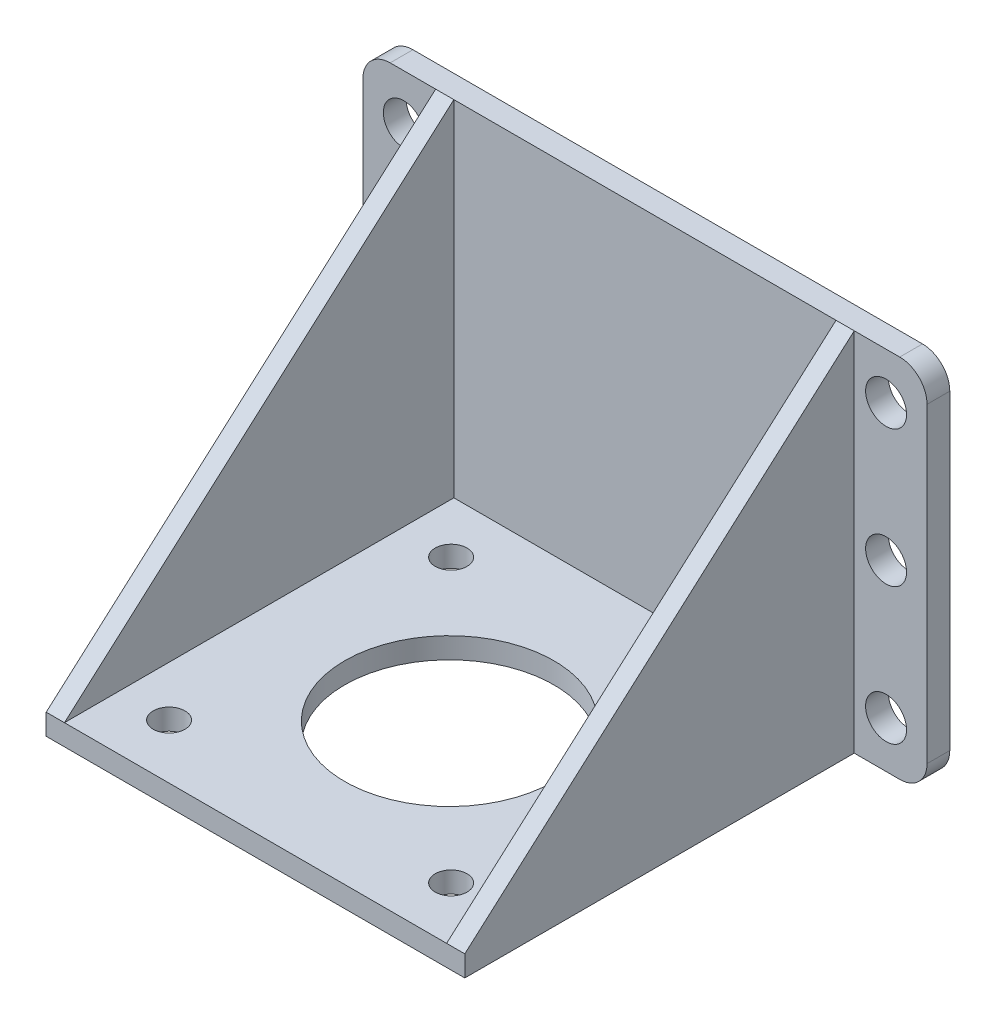
ISO-10303-21;
HEADER;
FILE_DESCRIPTION(('STEP AP214'),'2;1');
FILE_NAME('part.step','',(''),(''),'','','');
FILE_SCHEMA(('AUTOMOTIVE_DESIGN { 1 0 10303 214 1 1 1 1 }'));
ENDSEC;
DATA;
#1=APPLICATION_CONTEXT('core data for automotive mechanical design processes');
#2=APPLICATION_PROTOCOL_DEFINITION('international standard','automotive_design',2000,#1);
#3=PRODUCT_CONTEXT('',#1,'mechanical');
#4=PRODUCT('Part','Part','',(#3));
#5=PRODUCT_RELATED_PRODUCT_CATEGORY('part','',(#4));
#6=PRODUCT_DEFINITION_FORMATION('','',#4);
#7=PRODUCT_DEFINITION_CONTEXT('part definition',#1,'design');
#8=PRODUCT_DEFINITION('design','',#6,#7);
#9=PRODUCT_DEFINITION_SHAPE('','',#8);
#10=(LENGTH_UNIT() NAMED_UNIT(*) SI_UNIT(.MILLI.,.METRE.));
#11=(NAMED_UNIT(*) PLANE_ANGLE_UNIT() SI_UNIT($,.RADIAN.));
#12=(NAMED_UNIT(*) SI_UNIT($,.STERADIAN.) SOLID_ANGLE_UNIT());
#13=UNCERTAINTY_MEASURE_WITH_UNIT(LENGTH_MEASURE(1.E-05),#10,'distance_accuracy_value','');
#14=(GEOMETRIC_REPRESENTATION_CONTEXT(3) GLOBAL_UNCERTAINTY_ASSIGNED_CONTEXT((#13)) GLOBAL_UNIT_ASSIGNED_CONTEXT((#10,
#11,#12)) REPRESENTATION_CONTEXT('',''));
#15=CARTESIAN_POINT('',(0.,0.,0.));
#16=DIRECTION('',(0.,0.,1.));
#17=DIRECTION('',(1.,0.,0.));
#18=AXIS2_PLACEMENT_3D('',#15,#16,#17);
#19=CARTESIAN_POINT('',(31.,20.1,0.));
#20=DIRECTION('',(0.,0.,1.));
#21=DIRECTION('',(1.,0.,0.));
#22=AXIS2_PLACEMENT_3D('',#19,#20,#21);
#23=PLANE('',#22);
#24=CARTESIAN_POINT('',(57.5,5.1,0.));
#25=DIRECTION('',(0.,0.,-1.));
#26=DIRECTION('',(1.,0.,0.));
#27=AXIS2_PLACEMENT_3D('',#24,#25,#26);
#28=CIRCLE('',#27,2.25);
#29=CARTESIAN_POINT('',(55.25,5.1,0.));
#30=VERTEX_POINT('',#29);
#31=EDGE_CURVE('E488',#30,#30,#28,.T.);
#32=ORIENTED_EDGE('',*,*,#31,.F.);
#33=EDGE_LOOP('',(#32));
#34=FACE_BOUND('',#33,.T.);
#35=CARTESIAN_POINT('',(4.5,5.1,0.));
#36=DIRECTION('',(0.,0.,-1.));
#37=DIRECTION('',(1.,0.,0.));
#38=AXIS2_PLACEMENT_3D('',#35,#36,#37);
#39=CIRCLE('',#38,2.25);
#40=CARTESIAN_POINT('',(2.25,5.1,0.));
#41=VERTEX_POINT('',#40);
#42=EDGE_CURVE('E347',#41,#41,#39,.T.);
#43=ORIENTED_EDGE('',*,*,#42,.F.);
#44=EDGE_LOOP('',(#43));
#45=FACE_BOUND('',#44,.T.);
#46=CARTESIAN_POINT('',(4.5,35.1,0.));
#47=DIRECTION('',(0.,0.,-1.));
#48=DIRECTION('',(1.,0.,0.));
#49=AXIS2_PLACEMENT_3D('',#46,#47,#48);
#50=CIRCLE('',#49,2.25);
#51=CARTESIAN_POINT('',(2.25,35.1,0.));
#52=VERTEX_POINT('',#51);
#53=EDGE_CURVE('E346',#52,#52,#50,.T.);
#54=ORIENTED_EDGE('',*,*,#53,.F.);
#55=EDGE_LOOP('',(#54));
#56=FACE_BOUND('',#55,.T.);
#57=CARTESIAN_POINT('',(57.5,35.1,0.));
#58=DIRECTION('',(0.,0.,-1.));
#59=DIRECTION('',(1.,0.,0.));
#60=AXIS2_PLACEMENT_3D('',#57,#58,#59);
#61=CIRCLE('',#60,2.25);
#62=CARTESIAN_POINT('',(55.25,35.1,0.));
#63=VERTEX_POINT('',#62);
#64=EDGE_CURVE('E318',#63,#63,#61,.T.);
#65=ORIENTED_EDGE('',*,*,#64,.F.);
#66=EDGE_LOOP('',(#65));
#67=FACE_BOUND('',#66,.T.);
#68=CARTESIAN_POINT('',(4.5,20.1,0.));
#69=DIRECTION('',(0.,0.,-1.));
#70=DIRECTION('',(1.,0.,0.));
#71=AXIS2_PLACEMENT_3D('',#68,#69,#70);
#72=CIRCLE('',#71,2.25);
#73=CARTESIAN_POINT('',(2.25,20.1,0.));
#74=VERTEX_POINT('',#73);
#75=EDGE_CURVE('E335',#74,#74,#72,.T.);
#76=ORIENTED_EDGE('',*,*,#75,.F.);
#77=EDGE_LOOP('',(#76));
#78=FACE_BOUND('',#77,.T.);
#79=CARTESIAN_POINT('',(57.5,20.1,0.));
#80=DIRECTION('',(0.,0.,-1.));
#81=DIRECTION('',(1.,0.,0.));
#82=AXIS2_PLACEMENT_3D('',#79,#80,#81);
#83=CIRCLE('',#82,2.25);
#84=CARTESIAN_POINT('',(55.25,20.1,0.));
#85=VERTEX_POINT('',#84);
#86=EDGE_CURVE('E287',#85,#85,#83,.T.);
#87=ORIENTED_EDGE('',*,*,#86,.F.);
#88=EDGE_LOOP('',(#87));
#89=FACE_BOUND('',#88,.T.);
#90=CARTESIAN_POINT('',(3.,3.,0.));
#91=DIRECTION('',(0.,0.,1.));
#92=DIRECTION('',(-1.,0.,0.));
#93=AXIS2_PLACEMENT_3D('',#90,#91,#92);
#94=CIRCLE('',#93,3.);
#95=CARTESIAN_POINT('',(0.,3.,0.));
#96=VERTEX_POINT('',#95);
#97=CARTESIAN_POINT('',(3.,0.,0.));
#98=VERTEX_POINT('',#97);
#99=EDGE_CURVE('E11',#96,#98,#94,.T.);
#100=ORIENTED_EDGE('',*,*,#99,.F.);
#101=DIRECTION('',(0.,-1.,0.));
#102=VECTOR('',#101,1.);
#103=CARTESIAN_POINT('',(0.,37.2,0.));
#104=LINE('',#103,#102);
#105=CARTESIAN_POINT('',(0.,37.2,0.));
#106=VERTEX_POINT('',#105);
#107=EDGE_CURVE('E284',#106,#96,#104,.T.);
#108=ORIENTED_EDGE('',*,*,#107,.F.);
#109=CARTESIAN_POINT('',(3.,37.2,0.));
#110=DIRECTION('',(0.,0.,1.));
#111=DIRECTION('',(0.,1.,0.));
#112=AXIS2_PLACEMENT_3D('',#109,#110,#111);
#113=CIRCLE('',#112,3.);
#114=CARTESIAN_POINT('',(3.,40.2,0.));
#115=VERTEX_POINT('',#114);
#116=EDGE_CURVE('E231',#115,#106,#113,.T.);
#117=ORIENTED_EDGE('',*,*,#116,.F.);
#118=DIRECTION('',(-1.,0.,0.));
#119=VECTOR('',#118,1.);
#120=CARTESIAN_POINT('',(59.,40.2,0.));
#121=LINE('',#120,#119);
#122=CARTESIAN_POINT('',(59.,40.2,0.));
#123=VERTEX_POINT('',#122);
#124=EDGE_CURVE('E396',#123,#115,#121,.T.);
#125=ORIENTED_EDGE('',*,*,#124,.F.);
#126=CARTESIAN_POINT('',(59.,37.2,0.));
#127=DIRECTION('',(0.,0.,1.));
#128=DIRECTION('',(1.,0.,0.));
#129=AXIS2_PLACEMENT_3D('',#126,#127,#128);
#130=CIRCLE('',#129,3.);
#131=CARTESIAN_POINT('',(62.,37.2,0.));
#132=VERTEX_POINT('',#131);
#133=EDGE_CURVE('E425',#132,#123,#130,.T.);
#134=ORIENTED_EDGE('',*,*,#133,.F.);
#135=DIRECTION('',(0.,1.,0.));
#136=VECTOR('',#135,1.);
#137=CARTESIAN_POINT('',(62.,3.,0.));
#138=LINE('',#137,#136);
#139=CARTESIAN_POINT('',(62.,3.,0.));
#140=VERTEX_POINT('',#139);
#141=EDGE_CURVE('E361',#140,#132,#138,.T.);
#142=ORIENTED_EDGE('',*,*,#141,.F.);
#143=CARTESIAN_POINT('',(59.,3.,0.));
#144=DIRECTION('',(0.,0.,1.));
#145=DIRECTION('',(0.,-1.,0.));
#146=AXIS2_PLACEMENT_3D('',#143,#144,#145);
#147=CIRCLE('',#146,3.);
#148=CARTESIAN_POINT('',(59.,0.,0.));
#149=VERTEX_POINT('',#148);
#150=EDGE_CURVE('E360',#149,#140,#147,.T.);
#151=ORIENTED_EDGE('',*,*,#150,.F.);
#152=DIRECTION('',(1.,0.,0.));
#153=VECTOR('',#152,1.);
#154=CARTESIAN_POINT('',(3.,0.,0.));
#155=LINE('',#154,#153);
#156=EDGE_CURVE('E28',#98,#149,#155,.T.);
#157=ORIENTED_EDGE('',*,*,#156,.F.);
#158=EDGE_LOOP('',(#100,#108,#117,#125,#134,#142,#151,#157));
#159=FACE_BOUND('',#158,.T.);
#160=ADVANCED_FACE('F17',(#34,#45,#56,#67,#78,#89,#159),#23,.F.);
#161=CARTESIAN_POINT('',(3.,3.,0.));
#162=DIRECTION('',(0.,0.,1.));
#163=DIRECTION('',(-1.,0.,0.));
#164=AXIS2_PLACEMENT_3D('',#161,#162,#163);
#165=CYLINDRICAL_SURFACE('',#164,3.);
#166=ORIENTED_EDGE('',*,*,#99,.T.);
#167=DIRECTION('',(0.,0.,1.));
#168=VECTOR('',#167,1.);
#169=CARTESIAN_POINT('',(3.,0.,0.));
#170=LINE('',#169,#168);
#171=CARTESIAN_POINT('',(3.,0.,2.5));
#172=VERTEX_POINT('',#171);
#173=EDGE_CURVE('E402',#98,#172,#170,.T.);
#174=ORIENTED_EDGE('',*,*,#173,.T.);
#175=CARTESIAN_POINT('',(3.,3.,2.5));
#176=DIRECTION('',(0.,0.,1.));
#177=DIRECTION('',(-1.,0.,0.));
#178=AXIS2_PLACEMENT_3D('',#175,#176,#177);
#179=CIRCLE('',#178,3.);
#180=CARTESIAN_POINT('',(0.,3.,2.5));
#181=VERTEX_POINT('',#180);
#182=EDGE_CURVE('E245',#181,#172,#179,.T.);
#183=ORIENTED_EDGE('',*,*,#182,.F.);
#184=DIRECTION('',(0.,0.,1.));
#185=VECTOR('',#184,1.);
#186=CARTESIAN_POINT('',(0.,3.,0.));
#187=LINE('',#186,#185);
#188=EDGE_CURVE('E236',#96,#181,#187,.T.);
#189=ORIENTED_EDGE('',*,*,#188,.F.);
#190=EDGE_LOOP('',(#166,#174,#183,#189));
#191=FACE_BOUND('',#190,.T.);
#192=ADVANCED_FACE('F609',(#191),#165,.T.);
#193=CARTESIAN_POINT('',(3.,0.,0.));
#194=DIRECTION('',(0.,-1.,0.));
#195=DIRECTION('',(0.,0.,-1.));
#196=AXIS2_PLACEMENT_3D('',#193,#194,#195);
#197=PLANE('',#196);
#198=CARTESIAN_POINT('',(31.,0.,24.));
#199=DIRECTION('',(0.,1.,0.));
#200=DIRECTION('',(1.,0.,0.));
#201=AXIS2_PLACEMENT_3D('',#198,#199,#200);
#202=CIRCLE('',#201,11.5);
#203=CARTESIAN_POINT('',(19.5,0.,24.));
#204=VERTEX_POINT('',#203);
#205=EDGE_CURVE('E273',#204,#204,#202,.T.);
#206=ORIENTED_EDGE('',*,*,#205,.T.);
#207=EDGE_LOOP('',(#206));
#208=FACE_BOUND('',#207,.T.);
#209=CARTESIAN_POINT('',(15.5,0.,39.3));
#210=DIRECTION('',(0.,1.,0.));
#211=DIRECTION('',(1.,0.,0.));
#212=AXIS2_PLACEMENT_3D('',#209,#210,#211);
#213=CIRCLE('',#212,1.75);
#214=CARTESIAN_POINT('',(13.75,0.,39.3));
#215=VERTEX_POINT('',#214);
#216=EDGE_CURVE('E403',#215,#215,#213,.T.);
#217=ORIENTED_EDGE('',*,*,#216,.T.);
#218=EDGE_LOOP('',(#217));
#219=FACE_BOUND('',#218,.T.);
#220=CARTESIAN_POINT('',(46.5,0.,8.3));
#221=DIRECTION('',(0.,1.,0.));
#222=DIRECTION('',(1.,0.,0.));
#223=AXIS2_PLACEMENT_3D('',#220,#221,#222);
#224=CIRCLE('',#223,1.75);
#225=CARTESIAN_POINT('',(44.75,0.,8.3));
#226=VERTEX_POINT('',#225);
#227=EDGE_CURVE('E411',#226,#226,#224,.T.);
#228=ORIENTED_EDGE('',*,*,#227,.T.);
#229=EDGE_LOOP('',(#228));
#230=FACE_BOUND('',#229,.T.);
#231=CARTESIAN_POINT('',(46.5,0.,39.3));
#232=DIRECTION('',(0.,1.,0.));
#233=DIRECTION('',(1.,0.,0.));
#234=AXIS2_PLACEMENT_3D('',#231,#232,#233);
#235=CIRCLE('',#234,1.75);
#236=CARTESIAN_POINT('',(44.75,0.,39.3));
#237=VERTEX_POINT('',#236);
#238=EDGE_CURVE('E300',#237,#237,#235,.T.);
#239=ORIENTED_EDGE('',*,*,#238,.T.);
#240=EDGE_LOOP('',(#239));
#241=FACE_BOUND('',#240,.T.);
#242=CARTESIAN_POINT('',(15.5,0.,8.3));
#243=DIRECTION('',(0.,1.,0.));
#244=DIRECTION('',(1.,0.,0.));
#245=AXIS2_PLACEMENT_3D('',#242,#243,#244);
#246=CIRCLE('',#245,1.75);
#247=CARTESIAN_POINT('',(13.75,0.,8.3));
#248=VERTEX_POINT('',#247);
#249=EDGE_CURVE('E293',#248,#248,#246,.T.);
#250=ORIENTED_EDGE('',*,*,#249,.T.);
#251=EDGE_LOOP('',(#250));
#252=FACE_BOUND('',#251,.T.);
#253=DIRECTION('',(1.,0.,0.));
#254=VECTOR('',#253,1.);
#255=CARTESIAN_POINT('',(3.,0.,45.3));
#256=LINE('',#255,#254);
#257=CARTESIAN_POINT('',(8.,0.,45.3));
#258=VERTEX_POINT('',#257);
#259=CARTESIAN_POINT('',(54.,0.,45.3));
#260=VERTEX_POINT('',#259);
#261=EDGE_CURVE('E383',#258,#260,#256,.T.);
#262=ORIENTED_EDGE('',*,*,#261,.F.);
#263=DIRECTION('',(0.,0.,1.));
#264=VECTOR('',#263,1.);
#265=CARTESIAN_POINT('',(8.,0.,2.5));
#266=LINE('',#265,#264);
#267=CARTESIAN_POINT('',(8.,0.,2.5));
#268=VERTEX_POINT('',#267);
#269=EDGE_CURVE('E277',#268,#258,#266,.T.);
#270=ORIENTED_EDGE('',*,*,#269,.F.);
#271=DIRECTION('',(1.,0.,0.));
#272=VECTOR('',#271,1.);
#273=CARTESIAN_POINT('',(3.,0.,2.5));
#274=LINE('',#273,#272);
#275=EDGE_CURVE('E325',#172,#268,#274,.T.);
#276=ORIENTED_EDGE('',*,*,#275,.F.);
#277=ORIENTED_EDGE('',*,*,#173,.F.);
#278=ORIENTED_EDGE('',*,*,#156,.T.);
#279=DIRECTION('',(0.,0.,1.));
#280=VECTOR('',#279,1.);
#281=CARTESIAN_POINT('',(59.,0.,0.));
#282=LINE('',#281,#280);
#283=CARTESIAN_POINT('',(59.,0.,2.5));
#284=VERTEX_POINT('',#283);
#285=EDGE_CURVE('E453',#149,#284,#282,.T.);
#286=ORIENTED_EDGE('',*,*,#285,.T.);
#287=DIRECTION('',(1.,0.,0.));
#288=VECTOR('',#287,1.);
#289=CARTESIAN_POINT('',(3.,0.,2.5));
#290=LINE('',#289,#288);
#291=CARTESIAN_POINT('',(54.,0.,2.5));
#292=VERTEX_POINT('',#291);
#293=EDGE_CURVE('E378',#292,#284,#290,.T.);
#294=ORIENTED_EDGE('',*,*,#293,.F.);
#295=DIRECTION('',(0.,0.,1.));
#296=VECTOR('',#295,1.);
#297=CARTESIAN_POINT('',(54.,0.,2.5));
#298=LINE('',#297,#296);
#299=EDGE_CURVE('E283',#292,#260,#298,.T.);
#300=ORIENTED_EDGE('',*,*,#299,.T.);
#301=EDGE_LOOP('',(#262,#270,#276,#277,#278,#286,#294,#300));
#302=FACE_BOUND('',#301,.T.);
#303=ADVANCED_FACE('F607',(#208,#219,#230,#241,#252,#302),#197,.T.);
#304=CARTESIAN_POINT('',(59.,3.,0.));
#305=DIRECTION('',(0.,0.,1.));
#306=DIRECTION('',(0.,-1.,0.));
#307=AXIS2_PLACEMENT_3D('',#304,#305,#306);
#308=CYLINDRICAL_SURFACE('',#307,3.);
#309=ORIENTED_EDGE('',*,*,#150,.T.);
#310=DIRECTION('',(0.,0.,1.));
#311=VECTOR('',#310,1.);
#312=CARTESIAN_POINT('',(62.,3.,0.));
#313=LINE('',#312,#311);
#314=CARTESIAN_POINT('',(62.,3.,2.5));
#315=VERTEX_POINT('',#314);
#316=EDGE_CURVE('E357',#140,#315,#313,.T.);
#317=ORIENTED_EDGE('',*,*,#316,.T.);
#318=CARTESIAN_POINT('',(59.,3.,2.5));
#319=DIRECTION('',(0.,0.,1.));
#320=DIRECTION('',(0.,-1.,0.));
#321=AXIS2_PLACEMENT_3D('',#318,#319,#320);
#322=CIRCLE('',#321,3.);
#323=EDGE_CURVE('E382',#284,#315,#322,.T.);
#324=ORIENTED_EDGE('',*,*,#323,.F.);
#325=ORIENTED_EDGE('',*,*,#285,.F.);
#326=EDGE_LOOP('',(#309,#317,#324,#325));
#327=FACE_BOUND('',#326,.T.);
#328=ADVANCED_FACE('F533',(#327),#308,.T.);
#329=CARTESIAN_POINT('',(62.,3.,0.));
#330=DIRECTION('',(1.,0.,0.));
#331=DIRECTION('',(0.,1.,0.));
#332=AXIS2_PLACEMENT_3D('',#329,#330,#331);
#333=PLANE('',#332);
#334=ORIENTED_EDGE('',*,*,#141,.T.);
#335=DIRECTION('',(0.,0.,1.));
#336=VECTOR('',#335,1.);
#337=CARTESIAN_POINT('',(62.,37.2,0.));
#338=LINE('',#337,#336);
#339=CARTESIAN_POINT('',(62.,37.2,2.5));
#340=VERTEX_POINT('',#339);
#341=EDGE_CURVE('E447',#132,#340,#338,.T.);
#342=ORIENTED_EDGE('',*,*,#341,.T.);
#343=DIRECTION('',(0.,1.,0.));
#344=VECTOR('',#343,1.);
#345=CARTESIAN_POINT('',(62.,3.,2.5));
#346=LINE('',#345,#344);
#347=EDGE_CURVE('E470',#315,#340,#346,.T.);
#348=ORIENTED_EDGE('',*,*,#347,.F.);
#349=ORIENTED_EDGE('',*,*,#316,.F.);
#350=EDGE_LOOP('',(#334,#342,#348,#349));
#351=FACE_BOUND('',#350,.T.);
#352=ADVANCED_FACE('F538',(#351),#333,.T.);
#353=CARTESIAN_POINT('',(59.,37.2,0.));
#354=DIRECTION('',(0.,0.,1.));
#355=DIRECTION('',(1.,0.,0.));
#356=AXIS2_PLACEMENT_3D('',#353,#354,#355);
#357=CYLINDRICAL_SURFACE('',#356,3.);
#358=ORIENTED_EDGE('',*,*,#133,.T.);
#359=DIRECTION('',(0.,0.,1.));
#360=VECTOR('',#359,1.);
#361=CARTESIAN_POINT('',(59.,40.2,0.));
#362=LINE('',#361,#360);
#363=CARTESIAN_POINT('',(59.,40.2,2.5));
#364=VERTEX_POINT('',#363);
#365=EDGE_CURVE('E341',#123,#364,#362,.T.);
#366=ORIENTED_EDGE('',*,*,#365,.T.);
#367=CARTESIAN_POINT('',(59.,37.2,2.5));
#368=DIRECTION('',(0.,0.,1.));
#369=DIRECTION('',(1.,0.,0.));
#370=AXIS2_PLACEMENT_3D('',#367,#368,#369);
#371=CIRCLE('',#370,3.);
#372=EDGE_CURVE('E312',#340,#364,#371,.T.);
#373=ORIENTED_EDGE('',*,*,#372,.F.);
#374=ORIENTED_EDGE('',*,*,#341,.F.);
#375=EDGE_LOOP('',(#358,#366,#373,#374));
#376=FACE_BOUND('',#375,.T.);
#377=ADVANCED_FACE('F543',(#376),#357,.T.);
#378=CARTESIAN_POINT('',(59.,40.2,0.));
#379=DIRECTION('',(0.,1.,0.));
#380=DIRECTION('',(1.,0.,0.));
#381=AXIS2_PLACEMENT_3D('',#378,#379,#380);
#382=PLANE('',#381);
#383=DIRECTION('',(1.,0.,0.));
#384=VECTOR('',#383,1.);
#385=CARTESIAN_POINT('',(56.5,40.2,2.5));
#386=LINE('',#385,#384);
#387=CARTESIAN_POINT('',(52.,40.2,2.5));
#388=VERTEX_POINT('',#387);
#389=CARTESIAN_POINT('',(54.,40.2,2.5));
#390=VERTEX_POINT('',#389);
#391=EDGE_CURVE('E352',#388,#390,#386,.T.);
#392=ORIENTED_EDGE('',*,*,#391,.T.);
#393=DIRECTION('',(-1.,0.,0.));
#394=VECTOR('',#393,1.);
#395=CARTESIAN_POINT('',(59.,40.2,2.5));
#396=LINE('',#395,#394);
#397=EDGE_CURVE('E309',#364,#390,#396,.T.);
#398=ORIENTED_EDGE('',*,*,#397,.F.);
#399=ORIENTED_EDGE('',*,*,#365,.F.);
#400=ORIENTED_EDGE('',*,*,#124,.T.);
#401=DIRECTION('',(0.,0.,1.));
#402=VECTOR('',#401,1.);
#403=CARTESIAN_POINT('',(3.,40.2,0.));
#404=LINE('',#403,#402);
#405=CARTESIAN_POINT('',(3.,40.2,2.5));
#406=VERTEX_POINT('',#405);
#407=EDGE_CURVE('E338',#115,#406,#404,.T.);
#408=ORIENTED_EDGE('',*,*,#407,.T.);
#409=DIRECTION('',(-1.,0.,0.));
#410=VECTOR('',#409,1.);
#411=CARTESIAN_POINT('',(59.,40.2,2.5));
#412=LINE('',#411,#410);
#413=CARTESIAN_POINT('',(8.,40.2,2.5));
#414=VERTEX_POINT('',#413);
#415=EDGE_CURVE('E249',#414,#406,#412,.T.);
#416=ORIENTED_EDGE('',*,*,#415,.F.);
#417=DIRECTION('',(1.,0.,0.));
#418=VECTOR('',#417,1.);
#419=CARTESIAN_POINT('',(56.5,40.2,2.5));
#420=LINE('',#419,#418);
#421=CARTESIAN_POINT('',(10.,40.2,2.5));
#422=VERTEX_POINT('',#421);
#423=EDGE_CURVE('E266',#414,#422,#420,.T.);
#424=ORIENTED_EDGE('',*,*,#423,.T.);
#425=DIRECTION('',(-1.,0.,0.));
#426=VECTOR('',#425,1.);
#427=CARTESIAN_POINT('',(59.,40.2,2.5));
#428=LINE('',#427,#426);
#429=EDGE_CURVE('E267',#388,#422,#428,.T.);
#430=ORIENTED_EDGE('',*,*,#429,.F.);
#431=EDGE_LOOP('',(#392,#398,#399,#400,#408,#416,#424,#430));
#432=FACE_BOUND('',#431,.T.);
#433=ADVANCED_FACE('F583',(#432),#382,.T.);
#434=CARTESIAN_POINT('',(3.,37.2,0.));
#435=DIRECTION('',(0.,0.,1.));
#436=DIRECTION('',(0.,1.,0.));
#437=AXIS2_PLACEMENT_3D('',#434,#435,#436);
#438=CYLINDRICAL_SURFACE('',#437,3.);
#439=ORIENTED_EDGE('',*,*,#116,.T.);
#440=DIRECTION('',(0.,0.,1.));
#441=VECTOR('',#440,1.);
#442=CARTESIAN_POINT('',(0.,37.2,0.));
#443=LINE('',#442,#441);
#444=CARTESIAN_POINT('',(0.,37.2,2.5));
#445=VERTEX_POINT('',#444);
#446=EDGE_CURVE('E224',#106,#445,#443,.T.);
#447=ORIENTED_EDGE('',*,*,#446,.T.);
#448=CARTESIAN_POINT('',(3.,37.2,2.5));
#449=DIRECTION('',(0.,0.,1.));
#450=DIRECTION('',(0.,1.,0.));
#451=AXIS2_PLACEMENT_3D('',#448,#449,#450);
#452=CIRCLE('',#451,3.);
#453=EDGE_CURVE('E228',#406,#445,#452,.T.);
#454=ORIENTED_EDGE('',*,*,#453,.F.);
#455=ORIENTED_EDGE('',*,*,#407,.F.);
#456=EDGE_LOOP('',(#439,#447,#454,#455));
#457=FACE_BOUND('',#456,.T.);
#458=ADVANCED_FACE('F19',(#457),#438,.T.);
#459=CARTESIAN_POINT('',(0.,37.2,0.));
#460=DIRECTION('',(-1.,0.,0.));
#461=DIRECTION('',(0.,0.,1.));
#462=AXIS2_PLACEMENT_3D('',#459,#460,#461);
#463=PLANE('',#462);
#464=ORIENTED_EDGE('',*,*,#107,.T.);
#465=ORIENTED_EDGE('',*,*,#188,.T.);
#466=DIRECTION('',(0.,-1.,0.));
#467=VECTOR('',#466,1.);
#468=CARTESIAN_POINT('',(0.,37.2,2.5));
#469=LINE('',#468,#467);
#470=EDGE_CURVE('E239',#445,#181,#469,.T.);
#471=ORIENTED_EDGE('',*,*,#470,.F.);
#472=ORIENTED_EDGE('',*,*,#446,.F.);
#473=EDGE_LOOP('',(#464,#465,#471,#472));
#474=FACE_BOUND('',#473,.T.);
#475=ADVANCED_FACE('F240',(#474),#463,.T.);
#476=CARTESIAN_POINT('',(57.5,20.1,0.));
#477=DIRECTION('',(0.,0.,1.));
#478=DIRECTION('',(1.,0.,0.));
#479=AXIS2_PLACEMENT_3D('',#476,#477,#478);
#480=CYLINDRICAL_SURFACE('',#479,2.25);
#481=CARTESIAN_POINT('',(57.5,20.1,2.5));
#482=DIRECTION('',(0.,0.,-1.));
#483=DIRECTION('',(1.,0.,0.));
#484=AXIS2_PLACEMENT_3D('',#481,#482,#483);
#485=CIRCLE('',#484,2.25);
#486=CARTESIAN_POINT('',(55.25,20.1,2.5));
#487=VERTEX_POINT('',#486);
#488=EDGE_CURVE('E311',#487,#487,#485,.T.);
#489=ORIENTED_EDGE('',*,*,#488,.F.);
#490=DIRECTION('',(0.,0.,-1.));
#491=VECTOR('',#490,1.);
#492=CARTESIAN_POINT('',(55.25,20.1,0.));
#493=LINE('',#492,#491);
#494=EDGE_CURVE('E375',#487,#85,#493,.T.);
#495=ORIENTED_EDGE('',*,*,#494,.T.);
#496=ORIENTED_EDGE('',*,*,#86,.T.);
#497=ORIENTED_EDGE('',*,*,#494,.F.);
#498=EDGE_LOOP('',(#489,#495,#496,#497));
#499=FACE_BOUND('',#498,.T.);
#500=ADVANCED_FACE('F664',(#499),#480,.F.);
#501=CARTESIAN_POINT('',(4.5,20.1,0.));
#502=DIRECTION('',(0.,0.,1.));
#503=DIRECTION('',(1.,0.,0.));
#504=AXIS2_PLACEMENT_3D('',#501,#502,#503);
#505=CYLINDRICAL_SURFACE('',#504,2.25);
#506=CARTESIAN_POINT('',(4.5,20.1,2.5));
#507=DIRECTION('',(0.,0.,-1.));
#508=DIRECTION('',(1.,0.,0.));
#509=AXIS2_PLACEMENT_3D('',#506,#507,#508);
#510=CIRCLE('',#509,2.25);
#511=CARTESIAN_POINT('',(2.25,20.1,2.5));
#512=VERTEX_POINT('',#511);
#513=EDGE_CURVE('E331',#512,#512,#510,.T.);
#514=ORIENTED_EDGE('',*,*,#513,.F.);
#515=DIRECTION('',(0.,0.,-1.));
#516=VECTOR('',#515,1.);
#517=CARTESIAN_POINT('',(2.25,20.1,0.));
#518=LINE('',#517,#516);
#519=EDGE_CURVE('E321',#512,#74,#518,.T.);
#520=ORIENTED_EDGE('',*,*,#519,.T.);
#521=ORIENTED_EDGE('',*,*,#75,.T.);
#522=ORIENTED_EDGE('',*,*,#519,.F.);
#523=EDGE_LOOP('',(#514,#520,#521,#522));
#524=FACE_BOUND('',#523,.T.);
#525=ADVANCED_FACE('F660',(#524),#505,.F.);
#526=CARTESIAN_POINT('',(57.5,35.1,0.));
#527=DIRECTION('',(0.,0.,1.));
#528=DIRECTION('',(1.,0.,0.));
#529=AXIS2_PLACEMENT_3D('',#526,#527,#528);
#530=CYLINDRICAL_SURFACE('',#529,2.25);
#531=CARTESIAN_POINT('',(57.5,35.1,2.5));
#532=DIRECTION('',(0.,0.,-1.));
#533=DIRECTION('',(1.,0.,0.));
#534=AXIS2_PLACEMENT_3D('',#531,#532,#533);
#535=CIRCLE('',#534,2.25);
#536=CARTESIAN_POINT('',(55.25,35.1,2.5));
#537=VERTEX_POINT('',#536);
#538=EDGE_CURVE('E418',#537,#537,#535,.T.);
#539=ORIENTED_EDGE('',*,*,#538,.F.);
#540=DIRECTION('',(0.,0.,-1.));
#541=VECTOR('',#540,1.);
#542=CARTESIAN_POINT('',(55.25,35.1,0.));
#543=LINE('',#542,#541);
#544=EDGE_CURVE('E322',#537,#63,#543,.T.);
#545=ORIENTED_EDGE('',*,*,#544,.T.);
#546=ORIENTED_EDGE('',*,*,#64,.T.);
#547=ORIENTED_EDGE('',*,*,#544,.F.);
#548=EDGE_LOOP('',(#539,#545,#546,#547));
#549=FACE_BOUND('',#548,.T.);
#550=ADVANCED_FACE('F663',(#549),#530,.F.);
#551=CARTESIAN_POINT('',(4.5,35.1,0.));
#552=DIRECTION('',(0.,0.,1.));
#553=DIRECTION('',(1.,0.,0.));
#554=AXIS2_PLACEMENT_3D('',#551,#552,#553);
#555=CYLINDRICAL_SURFACE('',#554,2.25);
#556=CARTESIAN_POINT('',(4.5,35.1,2.5));
#557=DIRECTION('',(0.,0.,-1.));
#558=DIRECTION('',(1.,0.,0.));
#559=AXIS2_PLACEMENT_3D('',#556,#557,#558);
#560=CIRCLE('',#559,2.25);
#561=CARTESIAN_POINT('',(2.25,35.1,2.5));
#562=VERTEX_POINT('',#561);
#563=EDGE_CURVE('E326',#562,#562,#560,.T.);
#564=ORIENTED_EDGE('',*,*,#563,.F.);
#565=DIRECTION('',(0.,0.,-1.));
#566=VECTOR('',#565,1.);
#567=CARTESIAN_POINT('',(2.25,35.1,0.));
#568=LINE('',#567,#566);
#569=EDGE_CURVE('E342',#562,#52,#568,.T.);
#570=ORIENTED_EDGE('',*,*,#569,.T.);
#571=ORIENTED_EDGE('',*,*,#53,.T.);
#572=ORIENTED_EDGE('',*,*,#569,.F.);
#573=EDGE_LOOP('',(#564,#570,#571,#572));
#574=FACE_BOUND('',#573,.T.);
#575=ADVANCED_FACE('F635',(#574),#555,.F.);
#576=CARTESIAN_POINT('',(4.5,5.1,0.));
#577=DIRECTION('',(0.,0.,1.));
#578=DIRECTION('',(1.,0.,0.));
#579=AXIS2_PLACEMENT_3D('',#576,#577,#578);
#580=CYLINDRICAL_SURFACE('',#579,2.25);
#581=CARTESIAN_POINT('',(4.5,5.1,2.5));
#582=DIRECTION('',(0.,0.,-1.));
#583=DIRECTION('',(1.,0.,0.));
#584=AXIS2_PLACEMENT_3D('',#581,#582,#583);
#585=CIRCLE('',#584,2.25);
#586=CARTESIAN_POINT('',(2.25,5.1,2.5));
#587=VERTEX_POINT('',#586);
#588=EDGE_CURVE('E330',#587,#587,#585,.T.);
#589=ORIENTED_EDGE('',*,*,#588,.F.);
#590=DIRECTION('',(0.,0.,-1.));
#591=VECTOR('',#590,1.);
#592=CARTESIAN_POINT('',(2.25,5.1,0.));
#593=LINE('',#592,#591);
#594=EDGE_CURVE('E390',#587,#41,#593,.T.);
#595=ORIENTED_EDGE('',*,*,#594,.T.);
#596=ORIENTED_EDGE('',*,*,#42,.T.);
#597=ORIENTED_EDGE('',*,*,#594,.F.);
#598=EDGE_LOOP('',(#589,#595,#596,#597));
#599=FACE_BOUND('',#598,.T.);
#600=ADVANCED_FACE('F631',(#599),#580,.F.);
#601=CARTESIAN_POINT('',(57.5,5.1,0.));
#602=DIRECTION('',(0.,0.,1.));
#603=DIRECTION('',(1.,0.,0.));
#604=AXIS2_PLACEMENT_3D('',#601,#602,#603);
#605=CYLINDRICAL_SURFACE('',#604,2.25);
#606=CARTESIAN_POINT('',(57.5,5.1,2.5));
#607=DIRECTION('',(0.,0.,-1.));
#608=DIRECTION('',(1.,0.,0.));
#609=AXIS2_PLACEMENT_3D('',#606,#607,#608);
#610=CIRCLE('',#609,2.25);
#611=CARTESIAN_POINT('',(55.25,5.1,2.5));
#612=VERTEX_POINT('',#611);
#613=EDGE_CURVE('E256',#612,#612,#610,.T.);
#614=ORIENTED_EDGE('',*,*,#613,.F.);
#615=DIRECTION('',(0.,0.,-1.));
#616=VECTOR('',#615,1.);
#617=CARTESIAN_POINT('',(55.25,5.1,0.));
#618=LINE('',#617,#616);
#619=EDGE_CURVE('E444',#612,#30,#618,.T.);
#620=ORIENTED_EDGE('',*,*,#619,.T.);
#621=ORIENTED_EDGE('',*,*,#31,.T.);
#622=ORIENTED_EDGE('',*,*,#619,.F.);
#623=EDGE_LOOP('',(#614,#620,#621,#622));
#624=FACE_BOUND('',#623,.T.);
#625=ADVANCED_FACE('F634',(#624),#605,.F.);
#626=CARTESIAN_POINT('',(31.,20.1,2.5));
#627=DIRECTION('',(0.,0.,1.));
#628=DIRECTION('',(1.,0.,0.));
#629=AXIS2_PLACEMENT_3D('',#626,#627,#628);
#630=PLANE('',#629);
#631=ORIENTED_EDGE('',*,*,#588,.T.);
#632=EDGE_LOOP('',(#631));
#633=FACE_BOUND('',#632,.T.);
#634=ORIENTED_EDGE('',*,*,#563,.T.);
#635=EDGE_LOOP('',(#634));
#636=FACE_BOUND('',#635,.T.);
#637=ORIENTED_EDGE('',*,*,#513,.T.);
#638=EDGE_LOOP('',(#637));
#639=FACE_BOUND('',#638,.T.);
#640=DIRECTION('',(0.,1.,0.));
#641=VECTOR('',#640,1.);
#642=CARTESIAN_POINT('',(8.,30.15,2.5));
#643=LINE('',#642,#641);
#644=EDGE_CURVE('E274',#268,#414,#643,.T.);
#645=ORIENTED_EDGE('',*,*,#644,.T.);
#646=ORIENTED_EDGE('',*,*,#415,.T.);
#647=ORIENTED_EDGE('',*,*,#453,.T.);
#648=ORIENTED_EDGE('',*,*,#470,.T.);
#649=ORIENTED_EDGE('',*,*,#182,.T.);
#650=ORIENTED_EDGE('',*,*,#275,.T.);
#651=EDGE_LOOP('',(#645,#646,#647,#648,#649,#650));
#652=FACE_BOUND('',#651,.T.);
#653=ADVANCED_FACE('F248',(#633,#636,#639,#652),#630,.T.);
#654=CARTESIAN_POINT('',(31.,20.1,2.5));
#655=DIRECTION('',(0.,0.,1.));
#656=DIRECTION('',(1.,0.,0.));
#657=AXIS2_PLACEMENT_3D('',#654,#655,#656);
#658=PLANE('',#657);
#659=ORIENTED_EDGE('',*,*,#613,.T.);
#660=EDGE_LOOP('',(#659));
#661=FACE_BOUND('',#660,.T.);
#662=ORIENTED_EDGE('',*,*,#538,.T.);
#663=EDGE_LOOP('',(#662));
#664=FACE_BOUND('',#663,.T.);
#665=ORIENTED_EDGE('',*,*,#488,.T.);
#666=EDGE_LOOP('',(#665));
#667=FACE_BOUND('',#666,.T.);
#668=DIRECTION('',(0.,-1.,0.));
#669=VECTOR('',#668,1.);
#670=CARTESIAN_POINT('',(54.,10.05,2.5));
#671=LINE('',#670,#669);
#672=EDGE_CURVE('E279',#390,#292,#671,.T.);
#673=ORIENTED_EDGE('',*,*,#672,.T.);
#674=ORIENTED_EDGE('',*,*,#293,.T.);
#675=ORIENTED_EDGE('',*,*,#323,.T.);
#676=ORIENTED_EDGE('',*,*,#347,.T.);
#677=ORIENTED_EDGE('',*,*,#372,.T.);
#678=ORIENTED_EDGE('',*,*,#397,.T.);
#679=EDGE_LOOP('',(#673,#674,#675,#676,#677,#678));
#680=FACE_BOUND('',#679,.T.);
#681=ADVANCED_FACE('F530',(#661,#664,#667,#680),#658,.T.);
#682=CARTESIAN_POINT('',(54.,0.,2.5));
#683=DIRECTION('',(1.,0.,0.));
#684=DIRECTION('',(0.,1.,0.));
#685=AXIS2_PLACEMENT_3D('',#682,#683,#684);
#686=PLANE('',#685);
#687=ORIENTED_EDGE('',*,*,#672,.F.);
#688=DIRECTION('',(0.,-0.662951221346489,0.74866259297176));
#689=VECTOR('',#688,1.);
#690=CARTESIAN_POINT('',(54.,31.3659631301155,12.4761682857799));
#691=LINE('',#690,#689);
#692=CARTESIAN_POINT('',(54.,2.3,45.3));
#693=VERTEX_POINT('',#692);
#694=EDGE_CURVE('E348',#390,#693,#691,.T.);
#695=ORIENTED_EDGE('',*,*,#694,.T.);
#696=DIRECTION('',(0.,1.,0.));
#697=VECTOR('',#696,1.);
#698=CARTESIAN_POINT('',(54.,40.2,45.3));
#699=LINE('',#698,#697);
#700=EDGE_CURVE('E278',#260,#693,#699,.T.);
#701=ORIENTED_EDGE('',*,*,#700,.F.);
#702=ORIENTED_EDGE('',*,*,#299,.F.);
#703=EDGE_LOOP('',(#687,#695,#701,#702));
#704=FACE_BOUND('',#703,.T.);
#705=ADVANCED_FACE('F604',(#704),#686,.T.);
#706=CARTESIAN_POINT('',(8.,40.2,2.5));
#707=DIRECTION('',(-1.,0.,0.));
#708=DIRECTION('',(0.,0.,1.));
#709=AXIS2_PLACEMENT_3D('',#706,#707,#708);
#710=PLANE('',#709);
#711=DIRECTION('',(0.,0.662951221346489,-0.74866259297176));
#712=VECTOR('',#711,1.);
#713=CARTESIAN_POINT('',(8.,40.2,2.5));
#714=LINE('',#713,#712);
#715=CARTESIAN_POINT('',(8.,2.3,45.3));
#716=VERTEX_POINT('',#715);
#717=EDGE_CURVE('E260',#716,#414,#714,.T.);
#718=ORIENTED_EDGE('',*,*,#717,.T.);
#719=ORIENTED_EDGE('',*,*,#644,.F.);
#720=ORIENTED_EDGE('',*,*,#269,.T.);
#721=DIRECTION('',(0.,-1.,0.));
#722=VECTOR('',#721,1.);
#723=CARTESIAN_POINT('',(8.,40.2,45.3));
#724=LINE('',#723,#722);
#725=EDGE_CURVE('E387',#716,#258,#724,.T.);
#726=ORIENTED_EDGE('',*,*,#725,.F.);
#727=EDGE_LOOP('',(#718,#719,#720,#726));
#728=FACE_BOUND('',#727,.T.);
#729=ADVANCED_FACE('F597',(#728),#710,.T.);
#730=CARTESIAN_POINT('',(9.,20.1,45.3));
#731=DIRECTION('',(0.,0.,1.));
#732=DIRECTION('',(1.,0.,0.));
#733=AXIS2_PLACEMENT_3D('',#730,#731,#732);
#734=PLANE('',#733);
#735=DIRECTION('',(-1.,0.,0.));
#736=VECTOR('',#735,1.);
#737=CARTESIAN_POINT('',(31.5,2.3,45.3));
#738=LINE('',#737,#736);
#739=CARTESIAN_POINT('',(10.,2.3,45.3));
#740=VERTEX_POINT('',#739);
#741=EDGE_CURVE('E417',#740,#716,#738,.T.);
#742=ORIENTED_EDGE('',*,*,#741,.T.);
#743=ORIENTED_EDGE('',*,*,#725,.T.);
#744=ORIENTED_EDGE('',*,*,#261,.T.);
#745=ORIENTED_EDGE('',*,*,#700,.T.);
#746=DIRECTION('',(-1.,0.,0.));
#747=VECTOR('',#746,1.);
#748=CARTESIAN_POINT('',(53.5,2.3,45.3));
#749=LINE('',#748,#747);
#750=CARTESIAN_POINT('',(52.,2.3,45.3));
#751=VERTEX_POINT('',#750);
#752=EDGE_CURVE('E353',#693,#751,#749,.T.);
#753=ORIENTED_EDGE('',*,*,#752,.T.);
#754=DIRECTION('',(-1.,0.,0.));
#755=VECTOR('',#754,1.);
#756=CARTESIAN_POINT('',(54.,2.3,45.3));
#757=LINE('',#756,#755);
#758=EDGE_CURVE('E317',#751,#740,#757,.T.);
#759=ORIENTED_EDGE('',*,*,#758,.T.);
#760=EDGE_LOOP('',(#742,#743,#744,#745,#753,#759));
#761=FACE_BOUND('',#760,.T.);
#762=ADVANCED_FACE('F600',(#761),#734,.T.);
#763=CARTESIAN_POINT('',(54.,40.2,2.5));
#764=DIRECTION('',(0.,-0.74866259297176,-0.662951221346489));
#765=DIRECTION('',(0.,0.662951221346489,-0.74866259297176));
#766=AXIS2_PLACEMENT_3D('',#763,#764,#765);
#767=PLANE('',#766);
#768=DIRECTION('',(0.,0.662951221346489,-0.74866259297176));
#769=VECTOR('',#768,1.);
#770=CARTESIAN_POINT('',(52.,40.2,2.5));
#771=LINE('',#770,#769);
#772=EDGE_CURVE('E262',#751,#388,#771,.T.);
#773=ORIENTED_EDGE('',*,*,#772,.F.);
#774=ORIENTED_EDGE('',*,*,#752,.F.);
#775=ORIENTED_EDGE('',*,*,#694,.F.);
#776=ORIENTED_EDGE('',*,*,#391,.F.);
#777=EDGE_LOOP('',(#773,#774,#775,#776));
#778=FACE_BOUND('',#777,.T.);
#779=ADVANCED_FACE('F602',(#778),#767,.F.);
#780=CARTESIAN_POINT('',(54.,40.2,2.5));
#781=DIRECTION('',(0.,-0.74866259297176,-0.662951221346489));
#782=DIRECTION('',(0.,0.662951221346489,-0.74866259297176));
#783=AXIS2_PLACEMENT_3D('',#780,#781,#782);
#784=PLANE('',#783);
#785=DIRECTION('',(0.,-0.662951221346489,0.74866259297176));
#786=VECTOR('',#785,1.);
#787=CARTESIAN_POINT('',(10.,31.3659631301155,12.4761682857799));
#788=LINE('',#787,#786);
#789=EDGE_CURVE('E362',#422,#740,#788,.T.);
#790=ORIENTED_EDGE('',*,*,#789,.F.);
#791=ORIENTED_EDGE('',*,*,#423,.F.);
#792=ORIENTED_EDGE('',*,*,#717,.F.);
#793=ORIENTED_EDGE('',*,*,#741,.F.);
#794=EDGE_LOOP('',(#790,#791,#792,#793));
#795=FACE_BOUND('',#794,.T.);
#796=ADVANCED_FACE('F598',(#795),#784,.F.);
#797=CARTESIAN_POINT('',(52.,40.2,2.5));
#798=DIRECTION('',(-1.,0.,0.));
#799=DIRECTION('',(0.,0.,1.));
#800=AXIS2_PLACEMENT_3D('',#797,#798,#799);
#801=PLANE('',#800);
#802=DIRECTION('',(0.,0.,1.));
#803=VECTOR('',#802,1.);
#804=CARTESIAN_POINT('',(52.,2.3,23.9));
#805=LINE('',#804,#803);
#806=CARTESIAN_POINT('',(52.,2.3,2.5));
#807=VERTEX_POINT('',#806);
#808=EDGE_CURVE('E299',#807,#751,#805,.T.);
#809=ORIENTED_EDGE('',*,*,#808,.T.);
#810=ORIENTED_EDGE('',*,*,#772,.T.);
#811=DIRECTION('',(0.,1.,0.));
#812=VECTOR('',#811,1.);
#813=CARTESIAN_POINT('',(52.,30.15,2.5));
#814=LINE('',#813,#812);
#815=EDGE_CURVE('E366',#807,#388,#814,.T.);
#816=ORIENTED_EDGE('',*,*,#815,.F.);
#817=EDGE_LOOP('',(#809,#810,#816));
#818=FACE_BOUND('',#817,.T.);
#819=ADVANCED_FACE('F578',(#818),#801,.T.);
#820=CARTESIAN_POINT('',(31.,20.1,2.5));
#821=DIRECTION('',(0.,0.,1.));
#822=DIRECTION('',(1.,0.,0.));
#823=AXIS2_PLACEMENT_3D('',#820,#821,#822);
#824=PLANE('',#823);
#825=DIRECTION('',(1.,0.,0.));
#826=VECTOR('',#825,1.);
#827=CARTESIAN_POINT('',(42.5,2.3,2.5));
#828=LINE('',#827,#826);
#829=CARTESIAN_POINT('',(10.,2.3,2.5));
#830=VERTEX_POINT('',#829);
#831=EDGE_CURVE('E294',#830,#807,#828,.T.);
#832=ORIENTED_EDGE('',*,*,#831,.T.);
#833=ORIENTED_EDGE('',*,*,#815,.T.);
#834=ORIENTED_EDGE('',*,*,#429,.T.);
#835=DIRECTION('',(0.,-1.,0.));
#836=VECTOR('',#835,1.);
#837=CARTESIAN_POINT('',(10.,10.05,2.5));
#838=LINE('',#837,#836);
#839=EDGE_CURVE('E367',#422,#830,#838,.T.);
#840=ORIENTED_EDGE('',*,*,#839,.T.);
#841=EDGE_LOOP('',(#832,#833,#834,#840));
#842=FACE_BOUND('',#841,.T.);
#843=ADVANCED_FACE('F566',(#842),#824,.T.);
#844=CARTESIAN_POINT('',(10.,0.,2.5));
#845=DIRECTION('',(1.,0.,0.));
#846=DIRECTION('',(0.,1.,0.));
#847=AXIS2_PLACEMENT_3D('',#844,#845,#846);
#848=PLANE('',#847);
#849=DIRECTION('',(0.,0.,-1.));
#850=VECTOR('',#849,1.);
#851=CARTESIAN_POINT('',(10.,2.3,23.9));
#852=LINE('',#851,#850);
#853=EDGE_CURVE('E298',#740,#830,#852,.T.);
#854=ORIENTED_EDGE('',*,*,#853,.T.);
#855=ORIENTED_EDGE('',*,*,#839,.F.);
#856=ORIENTED_EDGE('',*,*,#789,.T.);
#857=EDGE_LOOP('',(#854,#855,#856));
#858=FACE_BOUND('',#857,.T.);
#859=ADVANCED_FACE('F573',(#858),#848,.T.);
#860=CARTESIAN_POINT('',(54.,2.3,45.3));
#861=DIRECTION('',(0.,1.,0.));
#862=DIRECTION('',(1.,0.,0.));
#863=AXIS2_PLACEMENT_3D('',#860,#861,#862);
#864=PLANE('',#863);
#865=CARTESIAN_POINT('',(31.,2.3,24.));
#866=DIRECTION('',(0.,-1.,0.));
#867=DIRECTION('',(1.,0.,0.));
#868=AXIS2_PLACEMENT_3D('',#865,#866,#867);
#869=CIRCLE('',#868,11.5);
#870=CARTESIAN_POINT('',(19.5,2.3,24.));
#871=VERTEX_POINT('',#870);
#872=EDGE_CURVE('E272',#871,#871,#869,.T.);
#873=ORIENTED_EDGE('',*,*,#872,.T.);
#874=EDGE_LOOP('',(#873));
#875=FACE_BOUND('',#874,.T.);
#876=CARTESIAN_POINT('',(15.5,2.3,39.3));
#877=DIRECTION('',(0.,-1.,0.));
#878=DIRECTION('',(1.,0.,0.));
#879=AXIS2_PLACEMENT_3D('',#876,#877,#878);
#880=CIRCLE('',#879,1.75);
#881=CARTESIAN_POINT('',(13.75,2.3,39.3));
#882=VERTEX_POINT('',#881);
#883=EDGE_CURVE('E368',#882,#882,#880,.T.);
#884=ORIENTED_EDGE('',*,*,#883,.T.);
#885=EDGE_LOOP('',(#884));
#886=FACE_BOUND('',#885,.T.);
#887=CARTESIAN_POINT('',(46.5,2.3,8.3));
#888=DIRECTION('',(0.,-1.,0.));
#889=DIRECTION('',(1.,0.,0.));
#890=AXIS2_PLACEMENT_3D('',#887,#888,#889);
#891=CIRCLE('',#890,1.75);
#892=CARTESIAN_POINT('',(44.75,2.3,8.3));
#893=VERTEX_POINT('',#892);
#894=EDGE_CURVE('E21',#893,#893,#891,.T.);
#895=ORIENTED_EDGE('',*,*,#894,.T.);
#896=EDGE_LOOP('',(#895));
#897=FACE_BOUND('',#896,.T.);
#898=CARTESIAN_POINT('',(46.5,2.3,39.3));
#899=DIRECTION('',(0.,-1.,0.));
#900=DIRECTION('',(1.,0.,0.));
#901=AXIS2_PLACEMENT_3D('',#898,#899,#900);
#902=CIRCLE('',#901,1.75);
#903=CARTESIAN_POINT('',(44.75,2.3,39.3));
#904=VERTEX_POINT('',#903);
#905=EDGE_CURVE('E308',#904,#904,#902,.T.);
#906=ORIENTED_EDGE('',*,*,#905,.T.);
#907=EDGE_LOOP('',(#906));
#908=FACE_BOUND('',#907,.T.);
#909=CARTESIAN_POINT('',(15.5,2.3,8.3));
#910=DIRECTION('',(0.,-1.,0.));
#911=DIRECTION('',(1.,0.,0.));
#912=AXIS2_PLACEMENT_3D('',#909,#910,#911);
#913=CIRCLE('',#912,1.75);
#914=CARTESIAN_POINT('',(13.75,2.3,8.3));
#915=VERTEX_POINT('',#914);
#916=EDGE_CURVE('E292',#915,#915,#913,.T.);
#917=ORIENTED_EDGE('',*,*,#916,.T.);
#918=EDGE_LOOP('',(#917));
#919=FACE_BOUND('',#918,.T.);
#920=ORIENTED_EDGE('',*,*,#808,.F.);
#921=ORIENTED_EDGE('',*,*,#831,.F.);
#922=ORIENTED_EDGE('',*,*,#853,.F.);
#923=ORIENTED_EDGE('',*,*,#758,.F.);
#924=EDGE_LOOP('',(#920,#921,#922,#923));
#925=FACE_BOUND('',#924,.T.);
#926=ADVANCED_FACE('F576',(#875,#886,#897,#908,#919,#925),#864,.T.);
#927=CARTESIAN_POINT('',(31.,0.,24.));
#928=DIRECTION('',(0.,1.,0.));
#929=DIRECTION('',(1.,0.,0.));
#930=AXIS2_PLACEMENT_3D('',#927,#928,#929);
#931=CYLINDRICAL_SURFACE('',#930,11.5);
#932=ORIENTED_EDGE('',*,*,#205,.F.);
#933=DIRECTION('',(0.,1.,0.));
#934=VECTOR('',#933,1.);
#935=CARTESIAN_POINT('',(19.5,0.,24.));
#936=LINE('',#935,#934);
#937=EDGE_CURVE('E268',#204,#871,#936,.T.);
#938=ORIENTED_EDGE('',*,*,#937,.T.);
#939=ORIENTED_EDGE('',*,*,#872,.F.);
#940=ORIENTED_EDGE('',*,*,#937,.F.);
#941=EDGE_LOOP('',(#932,#938,#939,#940));
#942=FACE_BOUND('',#941,.T.);
#943=ADVANCED_FACE('F716',(#942),#931,.F.);
#944=CARTESIAN_POINT('',(15.5,0.,39.3));
#945=DIRECTION('',(0.,1.,0.));
#946=DIRECTION('',(1.,0.,0.));
#947=AXIS2_PLACEMENT_3D('',#944,#945,#946);
#948=CYLINDRICAL_SURFACE('',#947,1.75);
#949=ORIENTED_EDGE('',*,*,#216,.F.);
#950=DIRECTION('',(0.,1.,0.));
#951=VECTOR('',#950,1.);
#952=CARTESIAN_POINT('',(13.75,0.,39.3));
#953=LINE('',#952,#951);
#954=EDGE_CURVE('E372',#215,#882,#953,.T.);
#955=ORIENTED_EDGE('',*,*,#954,.T.);
#956=ORIENTED_EDGE('',*,*,#883,.F.);
#957=ORIENTED_EDGE('',*,*,#954,.F.);
#958=EDGE_LOOP('',(#949,#955,#956,#957));
#959=FACE_BOUND('',#958,.T.);
#960=ADVANCED_FACE('F640',(#959),#948,.F.);
#961=CARTESIAN_POINT('',(46.5,0.,8.3));
#962=DIRECTION('',(0.,1.,0.));
#963=DIRECTION('',(1.,0.,0.));
#964=AXIS2_PLACEMENT_3D('',#961,#962,#963);
#965=CYLINDRICAL_SURFACE('',#964,1.75);
#966=ORIENTED_EDGE('',*,*,#227,.F.);
#967=DIRECTION('',(0.,1.,0.));
#968=VECTOR('',#967,1.);
#969=CARTESIAN_POINT('',(44.75,0.,8.3));
#970=LINE('',#969,#968);
#971=EDGE_CURVE('E407',#226,#893,#970,.T.);
#972=ORIENTED_EDGE('',*,*,#971,.T.);
#973=ORIENTED_EDGE('',*,*,#894,.F.);
#974=ORIENTED_EDGE('',*,*,#971,.F.);
#975=EDGE_LOOP('',(#966,#972,#973,#974));
#976=FACE_BOUND('',#975,.T.);
#977=ADVANCED_FACE('F637',(#976),#965,.F.);
#978=CARTESIAN_POINT('',(46.5,0.,39.3));
#979=DIRECTION('',(0.,1.,0.));
#980=DIRECTION('',(1.,0.,0.));
#981=AXIS2_PLACEMENT_3D('',#978,#979,#980);
#982=CYLINDRICAL_SURFACE('',#981,1.75);
#983=ORIENTED_EDGE('',*,*,#238,.F.);
#984=DIRECTION('',(0.,1.,0.));
#985=VECTOR('',#984,1.);
#986=CARTESIAN_POINT('',(44.75,0.,39.3));
#987=LINE('',#986,#985);
#988=EDGE_CURVE('E304',#237,#904,#987,.T.);
#989=ORIENTED_EDGE('',*,*,#988,.T.);
#990=ORIENTED_EDGE('',*,*,#905,.F.);
#991=ORIENTED_EDGE('',*,*,#988,.F.);
#992=EDGE_LOOP('',(#983,#989,#990,#991));
#993=FACE_BOUND('',#992,.T.);
#994=ADVANCED_FACE('F639',(#993),#982,.F.);
#995=CARTESIAN_POINT('',(15.5,0.,8.3));
#996=DIRECTION('',(0.,1.,0.));
#997=DIRECTION('',(1.,0.,0.));
#998=AXIS2_PLACEMENT_3D('',#995,#996,#997);
#999=CYLINDRICAL_SURFACE('',#998,1.75);
#1000=ORIENTED_EDGE('',*,*,#249,.F.);
#1001=DIRECTION('',(0.,1.,0.));
#1002=VECTOR('',#1001,1.);
#1003=CARTESIAN_POINT('',(13.75,0.,8.3));
#1004=LINE('',#1003,#1002);
#1005=EDGE_CURVE('E288',#248,#915,#1004,.T.);
#1006=ORIENTED_EDGE('',*,*,#1005,.T.);
#1007=ORIENTED_EDGE('',*,*,#916,.F.);
#1008=ORIENTED_EDGE('',*,*,#1005,.F.);
#1009=EDGE_LOOP('',(#1000,#1006,#1007,#1008));
#1010=FACE_BOUND('',#1009,.T.);
#1011=ADVANCED_FACE('F656',(#1010),#999,.F.);
#1012=CLOSED_SHELL('',(#160,#192,#303,#328,#352,#377,#433,#458,#475,#500,#525,#550,#575,#600,
#625,#653,#681,#705,#729,#762,#779,#796,#819,#843,#859,#926,#943,#960,#977,#994,#1011));
#1013=MANIFOLD_SOLID_BREP('B1',#1012);
#1014=ADVANCED_BREP_SHAPE_REPRESENTATION('',(#18,#1013),#14);
#1015=SHAPE_DEFINITION_REPRESENTATION(#9,#1014);
ENDSEC;
END-ISO-10303-21;
